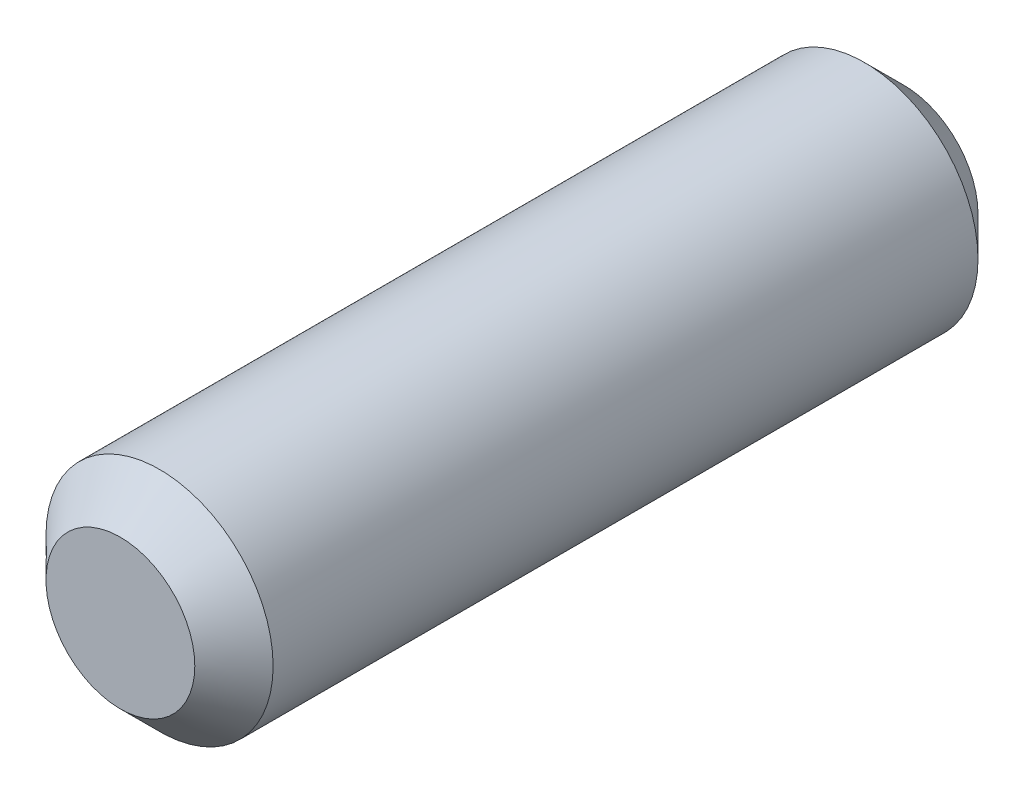
ISO-10303-21;
HEADER;
FILE_DESCRIPTION(('STEP AP214'),'2;1');
FILE_NAME('part.step','',(''),(''),'','','');
FILE_SCHEMA(('AUTOMOTIVE_DESIGN { 1 0 10303 214 1 1 1 1 }'));
ENDSEC;
DATA;
#1=APPLICATION_CONTEXT('core data for automotive mechanical design processes');
#2=APPLICATION_PROTOCOL_DEFINITION('international standard','automotive_design',2000,#1);
#3=PRODUCT_CONTEXT('',#1,'mechanical');
#4=PRODUCT('Part','Part','',(#3));
#5=PRODUCT_RELATED_PRODUCT_CATEGORY('part','',(#4));
#6=PRODUCT_DEFINITION_FORMATION('','',#4);
#7=PRODUCT_DEFINITION_CONTEXT('part definition',#1,'design');
#8=PRODUCT_DEFINITION('design','',#6,#7);
#9=PRODUCT_DEFINITION_SHAPE('','',#8);
#10=(LENGTH_UNIT() NAMED_UNIT(*) SI_UNIT(.MILLI.,.METRE.));
#11=(NAMED_UNIT(*) PLANE_ANGLE_UNIT() SI_UNIT($,.RADIAN.));
#12=(NAMED_UNIT(*) SI_UNIT($,.STERADIAN.) SOLID_ANGLE_UNIT());
#13=UNCERTAINTY_MEASURE_WITH_UNIT(LENGTH_MEASURE(1.E-05),#10,'distance_accuracy_value','');
#14=(GEOMETRIC_REPRESENTATION_CONTEXT(3) GLOBAL_UNCERTAINTY_ASSIGNED_CONTEXT((#13)) GLOBAL_UNIT_ASSIGNED_CONTEXT((#10,
#11,#12)) REPRESENTATION_CONTEXT('',''));
#15=CARTESIAN_POINT('',(0.,0.,0.));
#16=DIRECTION('',(0.,0.,1.));
#17=DIRECTION('',(1.,0.,0.));
#18=AXIS2_PLACEMENT_3D('',#15,#16,#17);
#19=CARTESIAN_POINT('',(0.,0.,10.));
#20=DIRECTION('',(0.,0.,-1.));
#21=DIRECTION('',(-1.,0.,0.));
#22=AXIS2_PLACEMENT_3D('',#19,#20,#21);
#23=CYLINDRICAL_SURFACE('',#22,1.45);
#24=CARTESIAN_POINT('',(0.,0.,9.5));
#25=DIRECTION('',(0.,0.,1.));
#26=DIRECTION('',(1.,0.,0.));
#27=AXIS2_PLACEMENT_3D('',#24,#25,#26);
#28=CIRCLE('',#27,1.45);
#29=CARTESIAN_POINT('',(1.45,0.,9.5));
#30=VERTEX_POINT('',#29);
#31=EDGE_CURVE('E47',#30,#30,#28,.F.);
#32=ORIENTED_EDGE('',*,*,#31,.T.);
#33=EDGE_LOOP('',(#32));
#34=FACE_BOUND('',#33,.T.);
#35=CARTESIAN_POINT('',(0.,0.,0.500000000000006));
#36=DIRECTION('',(0.,0.,1.));
#37=DIRECTION('',(1.,0.,0.));
#38=AXIS2_PLACEMENT_3D('',#35,#36,#37);
#39=CIRCLE('',#38,1.45);
#40=CARTESIAN_POINT('',(1.45,0.,0.500000000000006));
#41=VERTEX_POINT('',#40);
#42=EDGE_CURVE('E51',#41,#41,#39,.T.);
#43=ORIENTED_EDGE('',*,*,#42,.T.);
#44=EDGE_LOOP('',(#43));
#45=FACE_BOUND('',#44,.T.);
#46=ADVANCED_FACE('F39',(#34,#45),#23,.T.);
#47=CARTESIAN_POINT('',(0.,0.,10.));
#48=DIRECTION('',(0.,0.,1.));
#49=DIRECTION('',(1.,0.,0.));
#50=AXIS2_PLACEMENT_3D('',#47,#48,#49);
#51=PLANE('',#50);
#52=CARTESIAN_POINT('',(0.,0.,10.));
#53=DIRECTION('',(0.,0.,1.));
#54=DIRECTION('',(1.,0.,0.));
#55=AXIS2_PLACEMENT_3D('',#52,#53,#54);
#56=CIRCLE('',#55,0.95);
#57=CARTESIAN_POINT('',(0.95,0.,10.));
#58=VERTEX_POINT('',#57);
#59=EDGE_CURVE('E55',#58,#58,#56,.T.);
#60=ORIENTED_EDGE('',*,*,#59,.T.);
#61=EDGE_LOOP('',(#60));
#62=FACE_BOUND('',#61,.T.);
#63=ADVANCED_FACE('F61',(#62),#51,.T.);
#64=CARTESIAN_POINT('',(0.,0.,0.));
#65=DIRECTION('',(0.,0.,1.));
#66=DIRECTION('',(1.,0.,0.));
#67=AXIS2_PLACEMENT_3D('',#64,#65,#66);
#68=PLANE('',#67);
#69=CARTESIAN_POINT('',(0.,0.,0.));
#70=DIRECTION('',(0.,0.,1.));
#71=DIRECTION('',(1.,0.,0.));
#72=AXIS2_PLACEMENT_3D('',#69,#70,#71);
#73=CIRCLE('',#72,0.949999999999993);
#74=CARTESIAN_POINT('',(0.949999999999993,0.,0.));
#75=VERTEX_POINT('',#74);
#76=EDGE_CURVE('E10',#75,#75,#73,.F.);
#77=ORIENTED_EDGE('',*,*,#76,.T.);
#78=EDGE_LOOP('',(#77));
#79=FACE_BOUND('',#78,.T.);
#80=ADVANCED_FACE('F65',(#79),#68,.F.);
#81=CARTESIAN_POINT('',(0.,0.,10.));
#82=DIRECTION('',(0.,0.,-1.));
#83=DIRECTION('',(-1.,0.,0.));
#84=AXIS2_PLACEMENT_3D('',#81,#82,#83);
#85=CONICAL_SURFACE('',#84,0.95,0.785398163397447);
#86=ORIENTED_EDGE('',*,*,#31,.F.);
#87=EDGE_LOOP('',(#86));
#88=FACE_BOUND('',#87,.T.);
#89=ORIENTED_EDGE('',*,*,#59,.F.);
#90=EDGE_LOOP('',(#89));
#91=FACE_BOUND('',#90,.T.);
#92=ADVANCED_FACE('F63',(#88,#91),#85,.T.);
#93=CARTESIAN_POINT('',(0.,0.,0.500000000000006));
#94=DIRECTION('',(0.,0.,1.));
#95=DIRECTION('',(1.,0.,0.));
#96=AXIS2_PLACEMENT_3D('',#93,#94,#95);
#97=CONICAL_SURFACE('',#96,1.45,0.785398163397449);
#98=ORIENTED_EDGE('',*,*,#76,.F.);
#99=EDGE_LOOP('',(#98));
#100=FACE_BOUND('',#99,.T.);
#101=ORIENTED_EDGE('',*,*,#42,.F.);
#102=EDGE_LOOP('',(#101));
#103=FACE_BOUND('',#102,.T.);
#104=ADVANCED_FACE('F42',(#100,#103),#97,.T.);
#105=CLOSED_SHELL('',(#46,#63,#80,#92,#104));
#106=MANIFOLD_SOLID_BREP('B2',#105);
#107=ADVANCED_BREP_SHAPE_REPRESENTATION('',(#18,#106),#14);
#108=SHAPE_DEFINITION_REPRESENTATION(#9,#107);
ENDSEC;
END-ISO-10303-21;
